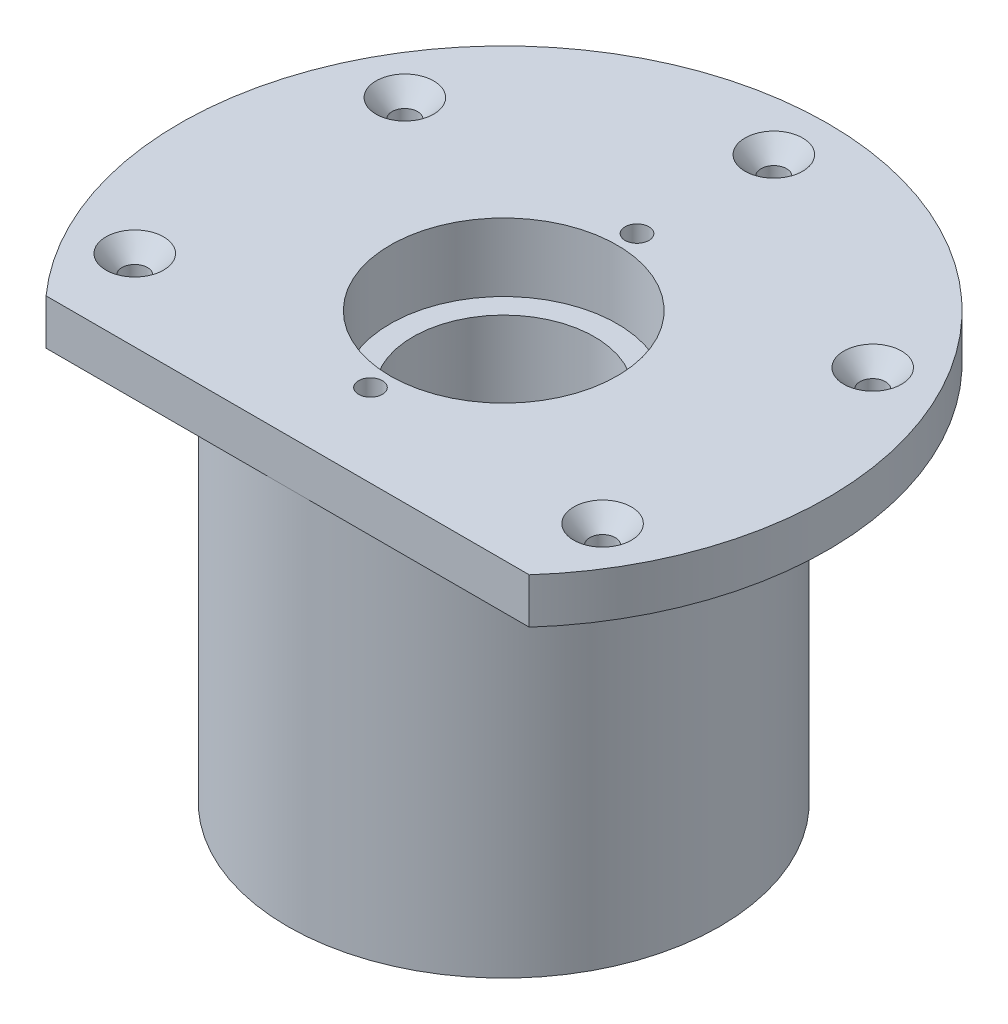
ISO-10303-21;
HEADER;
FILE_DESCRIPTION(('STEP AP214'),'2;1');
FILE_NAME('part.step','',(''),(''),'','','');
FILE_SCHEMA(('AUTOMOTIVE_DESIGN { 1 0 10303 214 1 1 1 1 }'));
ENDSEC;
DATA;
#1=APPLICATION_CONTEXT('core data for automotive mechanical design processes');
#2=APPLICATION_PROTOCOL_DEFINITION('international standard','automotive_design',2000,#1);
#3=PRODUCT_CONTEXT('',#1,'mechanical');
#4=PRODUCT('Part','Part','',(#3));
#5=PRODUCT_RELATED_PRODUCT_CATEGORY('part','',(#4));
#6=PRODUCT_DEFINITION_FORMATION('','',#4);
#7=PRODUCT_DEFINITION_CONTEXT('part definition',#1,'design');
#8=PRODUCT_DEFINITION('design','',#6,#7);
#9=PRODUCT_DEFINITION_SHAPE('','',#8);
#10=(LENGTH_UNIT() NAMED_UNIT(*) SI_UNIT(.MILLI.,.METRE.));
#11=(NAMED_UNIT(*) PLANE_ANGLE_UNIT() SI_UNIT($,.RADIAN.));
#12=(NAMED_UNIT(*) SI_UNIT($,.STERADIAN.) SOLID_ANGLE_UNIT());
#13=UNCERTAINTY_MEASURE_WITH_UNIT(LENGTH_MEASURE(1.E-05),#10,'distance_accuracy_value','');
#14=(GEOMETRIC_REPRESENTATION_CONTEXT(3) GLOBAL_UNCERTAINTY_ASSIGNED_CONTEXT((#13)) GLOBAL_UNIT_ASSIGNED_CONTEXT((#10,
#11,#12)) REPRESENTATION_CONTEXT('',''));
#15=CARTESIAN_POINT('',(0.,0.,0.));
#16=DIRECTION('',(0.,0.,1.));
#17=DIRECTION('',(1.,0.,0.));
#18=AXIS2_PLACEMENT_3D('',#15,#16,#17);
#19=CARTESIAN_POINT('',(0.,75.,0.));
#20=DIRECTION('',(0.,-1.,0.));
#21=DIRECTION('',(0.,0.,-1.));
#22=AXIS2_PLACEMENT_3D('',#19,#20,#21);
#23=CYLINDRICAL_SURFACE('',#22,20.);
#24=CARTESIAN_POINT('',(0.,0.,0.));
#25=DIRECTION('',(0.,1.,0.));
#26=DIRECTION('',(0.,0.,1.));
#27=AXIS2_PLACEMENT_3D('',#24,#25,#26);
#28=CIRCLE('',#27,20.);
#29=CARTESIAN_POINT('',(0.,0.,20.));
#30=VERTEX_POINT('',#29);
#31=EDGE_CURVE('E76',#30,#30,#28,.T.);
#32=ORIENTED_EDGE('',*,*,#31,.F.);
#33=EDGE_LOOP('',(#32));
#34=FACE_BOUND('',#33,.T.);
#35=CARTESIAN_POINT('',(0.,12.,0.));
#36=DIRECTION('',(0.,1.,0.));
#37=DIRECTION('',(0.,0.,1.));
#38=AXIS2_PLACEMENT_3D('',#35,#36,#37);
#39=CIRCLE('',#38,20.);
#40=CARTESIAN_POINT('',(0.,12.,20.));
#41=VERTEX_POINT('',#40);
#42=EDGE_CURVE('E282',#41,#41,#39,.F.);
#43=ORIENTED_EDGE('',*,*,#42,.F.);
#44=EDGE_LOOP('',(#43));
#45=FACE_BOUND('',#44,.T.);
#46=ADVANCED_FACE('F39',(#34,#45),#23,.F.);
#47=CARTESIAN_POINT('',(0.,75.,0.));
#48=DIRECTION('',(0.,-1.,0.));
#49=DIRECTION('',(0.,0.,-1.));
#50=AXIS2_PLACEMENT_3D('',#47,#48,#49);
#51=CYLINDRICAL_SURFACE('',#50,38.1);
#52=CARTESIAN_POINT('',(0.,0.,0.));
#53=DIRECTION('',(0.,1.,0.));
#54=DIRECTION('',(0.,0.,1.));
#55=AXIS2_PLACEMENT_3D('',#52,#53,#54);
#56=CIRCLE('',#55,38.1);
#57=CARTESIAN_POINT('',(0.,0.,38.1));
#58=VERTEX_POINT('',#57);
#59=EDGE_CURVE('E95',#58,#58,#56,.T.);
#60=ORIENTED_EDGE('',*,*,#59,.T.);
#61=EDGE_LOOP('',(#60));
#62=FACE_BOUND('',#61,.T.);
#63=CARTESIAN_POINT('',(0.,67.,0.));
#64=DIRECTION('',(0.,1.,0.));
#65=DIRECTION('',(0.,0.,1.));
#66=AXIS2_PLACEMENT_3D('',#63,#64,#65);
#67=CIRCLE('',#66,38.1);
#68=CARTESIAN_POINT('',(0.,67.,38.1));
#69=VERTEX_POINT('',#68);
#70=EDGE_CURVE('E47',#69,#69,#67,.T.);
#71=ORIENTED_EDGE('',*,*,#70,.F.);
#72=EDGE_LOOP('',(#71));
#73=FACE_BOUND('',#72,.T.);
#74=ADVANCED_FACE('F41',(#62,#73),#51,.T.);
#75=CARTESIAN_POINT('',(0.,75.,0.));
#76=DIRECTION('',(0.,1.,0.));
#77=DIRECTION('',(0.,0.,1.));
#78=AXIS2_PLACEMENT_3D('',#75,#76,#77);
#79=PLANE('',#78);
#80=CARTESIAN_POINT('',(0.,75.,-23.5));
#81=DIRECTION('',(0.,1.,0.));
#82=DIRECTION('',(0.,0.,1.));
#83=AXIS2_PLACEMENT_3D('',#80,#81,#82);
#84=CIRCLE('',#83,2.1);
#85=CARTESIAN_POINT('',(0.,75.,-21.4));
#86=VERTEX_POINT('',#85);
#87=EDGE_CURVE('E193',#86,#86,#84,.T.);
#88=ORIENTED_EDGE('',*,*,#87,.F.);
#89=EDGE_LOOP('',(#88));
#90=FACE_BOUND('',#89,.T.);
#91=CARTESIAN_POINT('',(0.,75.,23.5));
#92=DIRECTION('',(0.,1.,0.));
#93=DIRECTION('',(0.,0.,1.));
#94=AXIS2_PLACEMENT_3D('',#91,#92,#93);
#95=CIRCLE('',#94,2.1);
#96=CARTESIAN_POINT('',(0.,75.,25.6));
#97=VERTEX_POINT('',#96);
#98=EDGE_CURVE('E197',#97,#97,#95,.T.);
#99=ORIENTED_EDGE('',*,*,#98,.F.);
#100=EDGE_LOOP('',(#99));
#101=FACE_BOUND('',#100,.T.);
#102=CARTESIAN_POINT('',(-41.2444598552339,75.,23.8125000000001));
#103=DIRECTION('',(0.,1.,0.));
#104=DIRECTION('',(0.,0.,1.));
#105=AXIS2_PLACEMENT_3D('',#102,#103,#104);
#106=CIRCLE('',#105,5.0856896);
#107=CARTESIAN_POINT('',(-41.2444598552339,75.,28.8981896000001));
#108=VERTEX_POINT('',#107);
#109=EDGE_CURVE('E129',#108,#108,#106,.T.);
#110=ORIENTED_EDGE('',*,*,#109,.F.);
#111=EDGE_LOOP('',(#110));
#112=FACE_BOUND('',#111,.T.);
#113=CARTESIAN_POINT('',(-41.2444598552339,75.,-23.8124999999999));
#114=DIRECTION('',(0.,1.,0.));
#115=DIRECTION('',(0.,0.,1.));
#116=AXIS2_PLACEMENT_3D('',#113,#114,#115);
#117=CIRCLE('',#116,5.0856896);
#118=CARTESIAN_POINT('',(-41.2444598552339,75.,-18.7268103999999));
#119=VERTEX_POINT('',#118);
#120=EDGE_CURVE('E122',#119,#119,#117,.T.);
#121=ORIENTED_EDGE('',*,*,#120,.F.);
#122=EDGE_LOOP('',(#121));
#123=FACE_BOUND('',#122,.T.);
#124=CARTESIAN_POINT('',(0.,75.,-47.625));
#125=DIRECTION('',(0.,1.,0.));
#126=DIRECTION('',(0.,0.,1.));
#127=AXIS2_PLACEMENT_3D('',#124,#125,#126);
#128=CIRCLE('',#127,5.0856896);
#129=CARTESIAN_POINT('',(0.,75.,-42.5393104));
#130=VERTEX_POINT('',#129);
#131=EDGE_CURVE('E118',#130,#130,#128,.T.);
#132=ORIENTED_EDGE('',*,*,#131,.F.);
#133=EDGE_LOOP('',(#132));
#134=FACE_BOUND('',#133,.T.);
#135=CARTESIAN_POINT('',(41.2444598552339,75.,-23.8125000000001));
#136=DIRECTION('',(0.,1.,0.));
#137=DIRECTION('',(0.,0.,1.));
#138=AXIS2_PLACEMENT_3D('',#135,#136,#137);
#139=CIRCLE('',#138,5.0856896);
#140=CARTESIAN_POINT('',(41.2444598552339,75.,-18.7268104000001));
#141=VERTEX_POINT('',#140);
#142=EDGE_CURVE('E114',#141,#141,#139,.T.);
#143=ORIENTED_EDGE('',*,*,#142,.F.);
#144=EDGE_LOOP('',(#143));
#145=FACE_BOUND('',#144,.T.);
#146=CARTESIAN_POINT('',(41.2444598552339,75.,23.8124999999999));
#147=DIRECTION('',(0.,1.,0.));
#148=DIRECTION('',(0.,0.,1.));
#149=AXIS2_PLACEMENT_3D('',#146,#147,#148);
#150=CIRCLE('',#149,5.0856896);
#151=CARTESIAN_POINT('',(41.2444598552339,75.,28.8981895999999));
#152=VERTEX_POINT('',#151);
#153=EDGE_CURVE('E109',#152,#152,#150,.T.);
#154=ORIENTED_EDGE('',*,*,#153,.F.);
#155=EDGE_LOOP('',(#154));
#156=FACE_BOUND('',#155,.T.);
#157=DIRECTION('',(1.,0.,0.));
#158=VECTOR('',#157,1.);
#159=CARTESIAN_POINT('',(0.,75.,38.1));
#160=LINE('',#159,#158);
#161=CARTESIAN_POINT('',(-42.597094971371,75.,38.1));
#162=VERTEX_POINT('',#161);
#163=CARTESIAN_POINT('',(42.597094971371,75.,38.1));
#164=VERTEX_POINT('',#163);
#165=EDGE_CURVE('E80',#162,#164,#160,.T.);
#166=ORIENTED_EDGE('',*,*,#165,.T.);
#167=CARTESIAN_POINT('',(0.,75.,0.));
#168=DIRECTION('',(0.,1.,0.));
#169=DIRECTION('',(0.,0.,1.));
#170=AXIS2_PLACEMENT_3D('',#167,#168,#169);
#171=CIRCLE('',#170,57.15);
#172=EDGE_CURVE('E73',#164,#162,#171,.T.);
#173=ORIENTED_EDGE('',*,*,#172,.T.);
#174=EDGE_LOOP('',(#166,#173));
#175=FACE_BOUND('',#174,.T.);
#176=CARTESIAN_POINT('',(0.,75.,0.));
#177=DIRECTION('',(0.,1.,0.));
#178=DIRECTION('',(0.,0.,1.));
#179=AXIS2_PLACEMENT_3D('',#176,#177,#178);
#180=CIRCLE('',#179,20.);
#181=CARTESIAN_POINT('',(0.,75.,20.));
#182=VERTEX_POINT('',#181);
#183=EDGE_CURVE('E96',#182,#182,#180,.T.);
#184=ORIENTED_EDGE('',*,*,#183,.F.);
#185=EDGE_LOOP('',(#184));
#186=FACE_BOUND('',#185,.T.);
#187=ADVANCED_FACE('F85',(#90,#101,#112,#123,#134,#145,#156,#175,#186),#79,.T.);
#188=CARTESIAN_POINT('',(0.,0.,0.));
#189=DIRECTION('',(0.,1.,0.));
#190=DIRECTION('',(0.,0.,1.));
#191=AXIS2_PLACEMENT_3D('',#188,#189,#190);
#192=PLANE('',#191);
#193=CARTESIAN_POINT('',(0.,0.,-23.5));
#194=DIRECTION('',(0.,1.,0.));
#195=DIRECTION('',(0.,0.,1.));
#196=AXIS2_PLACEMENT_3D('',#193,#194,#195);
#197=CIRCLE('',#196,2.09999999999999);
#198=CARTESIAN_POINT('',(0.,0.,-21.4));
#199=VERTEX_POINT('',#198);
#200=EDGE_CURVE('E273',#199,#199,#197,.T.);
#201=ORIENTED_EDGE('',*,*,#200,.T.);
#202=EDGE_LOOP('',(#201));
#203=FACE_BOUND('',#202,.T.);
#204=CARTESIAN_POINT('',(0.,0.,23.5));
#205=DIRECTION('',(0.,1.,0.));
#206=DIRECTION('',(0.,0.,1.));
#207=AXIS2_PLACEMENT_3D('',#204,#205,#206);
#208=CIRCLE('',#207,2.09999999999999);
#209=CARTESIAN_POINT('',(0.,0.,25.6));
#210=VERTEX_POINT('',#209);
#211=EDGE_CURVE('E278',#210,#210,#208,.T.);
#212=ORIENTED_EDGE('',*,*,#211,.T.);
#213=EDGE_LOOP('',(#212));
#214=FACE_BOUND('',#213,.T.);
#215=ORIENTED_EDGE('',*,*,#59,.F.);
#216=EDGE_LOOP('',(#215));
#217=FACE_BOUND('',#216,.T.);
#218=ORIENTED_EDGE('',*,*,#31,.T.);
#219=EDGE_LOOP('',(#218));
#220=FACE_BOUND('',#219,.T.);
#221=ADVANCED_FACE('F177',(#203,#214,#217,#220),#192,.F.);
#222=CARTESIAN_POINT('',(0.,63.,0.));
#223=DIRECTION('',(0.,1.,0.));
#224=DIRECTION('',(0.,0.,1.));
#225=AXIS2_PLACEMENT_3D('',#222,#223,#224);
#226=CIRCLE('',#225,20.);
#227=CARTESIAN_POINT('',(0.,63.,20.));
#228=VERTEX_POINT('',#227);
#229=EDGE_CURVE('E12',#228,#228,#226,.T.);
#230=ORIENTED_EDGE('',*,*,#229,.F.);
#231=EDGE_LOOP('',(#230));
#232=FACE_BOUND('',#231,.T.);
#233=ORIENTED_EDGE('',*,*,#183,.T.);
#234=EDGE_LOOP('',(#233));
#235=FACE_BOUND('',#234,.T.);
#236=ADVANCED_FACE('F162',(#232,#235),#23,.F.);
#237=CARTESIAN_POINT('',(0.,67.,38.1));
#238=DIRECTION('',(0.,0.,1.));
#239=DIRECTION('',(1.,0.,0.));
#240=AXIS2_PLACEMENT_3D('',#237,#238,#239);
#241=PLANE('',#240);
#242=DIRECTION('',(1.,0.,0.));
#243=VECTOR('',#242,1.);
#244=CARTESIAN_POINT('',(0.,67.,38.1));
#245=LINE('',#244,#243);
#246=CARTESIAN_POINT('',(-42.597094971371,67.,38.1));
#247=VERTEX_POINT('',#246);
#248=EDGE_CURVE('E89',#247,#69,#245,.T.);
#249=ORIENTED_EDGE('',*,*,#248,.T.);
#250=CARTESIAN_POINT('',(42.597094971371,67.,38.1));
#251=VERTEX_POINT('',#250);
#252=EDGE_CURVE('E87',#69,#251,#245,.T.);
#253=ORIENTED_EDGE('',*,*,#252,.T.);
#254=DIRECTION('',(0.,1.,0.));
#255=VECTOR('',#254,1.);
#256=CARTESIAN_POINT('',(42.597094971371,67.,38.1));
#257=LINE('',#256,#255);
#258=EDGE_CURVE('E77',#251,#164,#257,.T.);
#259=ORIENTED_EDGE('',*,*,#258,.T.);
#260=ORIENTED_EDGE('',*,*,#165,.F.);
#261=DIRECTION('',(0.,1.,0.));
#262=VECTOR('',#261,1.);
#263=CARTESIAN_POINT('',(-42.597094971371,67.,38.1));
#264=LINE('',#263,#262);
#265=EDGE_CURVE('E59',#247,#162,#264,.T.);
#266=ORIENTED_EDGE('',*,*,#265,.F.);
#267=EDGE_LOOP('',(#249,#253,#259,#260,#266));
#268=FACE_BOUND('',#267,.T.);
#269=ADVANCED_FACE('F81',(#268),#241,.T.);
#270=CARTESIAN_POINT('',(0.,67.,0.));
#271=DIRECTION('',(0.,1.,0.));
#272=DIRECTION('',(0.,0.,1.));
#273=AXIS2_PLACEMENT_3D('',#270,#271,#272);
#274=PLANE('',#273);
#275=CARTESIAN_POINT('',(-41.2444598552339,67.,23.8125000000001));
#276=DIRECTION('',(0.,1.,0.));
#277=DIRECTION('',(0.,0.,1.));
#278=AXIS2_PLACEMENT_3D('',#275,#276,#277);
#279=CIRCLE('',#278,2.24789999999998);
#280=CARTESIAN_POINT('',(-41.2444598552339,67.,26.0604));
#281=VERTEX_POINT('',#280);
#282=EDGE_CURVE('E120',#281,#281,#279,.T.);
#283=ORIENTED_EDGE('',*,*,#282,.T.);
#284=EDGE_LOOP('',(#283));
#285=FACE_BOUND('',#284,.T.);
#286=CARTESIAN_POINT('',(-41.2444598552339,67.,-23.8124999999999));
#287=DIRECTION('',(0.,1.,0.));
#288=DIRECTION('',(0.,0.,1.));
#289=AXIS2_PLACEMENT_3D('',#286,#287,#288);
#290=CIRCLE('',#289,2.24789999999998);
#291=CARTESIAN_POINT('',(-41.2444598552339,67.,-21.5645999999999));
#292=VERTEX_POINT('',#291);
#293=EDGE_CURVE('E116',#292,#292,#290,.T.);
#294=ORIENTED_EDGE('',*,*,#293,.T.);
#295=EDGE_LOOP('',(#294));
#296=FACE_BOUND('',#295,.T.);
#297=CARTESIAN_POINT('',(0.,67.,-47.625));
#298=DIRECTION('',(0.,1.,0.));
#299=DIRECTION('',(0.,0.,1.));
#300=AXIS2_PLACEMENT_3D('',#297,#298,#299);
#301=CIRCLE('',#300,2.24789999999999);
#302=CARTESIAN_POINT('',(0.,67.,-45.3771));
#303=VERTEX_POINT('',#302);
#304=EDGE_CURVE('E111',#303,#303,#301,.T.);
#305=ORIENTED_EDGE('',*,*,#304,.T.);
#306=EDGE_LOOP('',(#305));
#307=FACE_BOUND('',#306,.T.);
#308=CARTESIAN_POINT('',(41.2444598552339,67.,-23.8125000000001));
#309=DIRECTION('',(0.,1.,0.));
#310=DIRECTION('',(0.,0.,1.));
#311=AXIS2_PLACEMENT_3D('',#308,#309,#310);
#312=CIRCLE('',#311,2.24789999999998);
#313=CARTESIAN_POINT('',(41.2444598552339,67.,-21.5646000000001));
#314=VERTEX_POINT('',#313);
#315=EDGE_CURVE('E106',#314,#314,#312,.T.);
#316=ORIENTED_EDGE('',*,*,#315,.T.);
#317=EDGE_LOOP('',(#316));
#318=FACE_BOUND('',#317,.T.);
#319=CARTESIAN_POINT('',(41.2444598552339,67.,23.8124999999999));
#320=DIRECTION('',(0.,1.,0.));
#321=DIRECTION('',(0.,0.,1.));
#322=AXIS2_PLACEMENT_3D('',#319,#320,#321);
#323=CIRCLE('',#322,2.24789999999998);
#324=CARTESIAN_POINT('',(41.2444598552339,67.,26.0603999999999));
#325=VERTEX_POINT('',#324);
#326=EDGE_CURVE('E83',#325,#325,#323,.T.);
#327=ORIENTED_EDGE('',*,*,#326,.T.);
#328=EDGE_LOOP('',(#327));
#329=FACE_BOUND('',#328,.T.);
#330=ORIENTED_EDGE('',*,*,#252,.F.);
#331=ORIENTED_EDGE('',*,*,#70,.T.);
#332=ORIENTED_EDGE('',*,*,#248,.F.);
#333=CARTESIAN_POINT('',(0.,67.,0.));
#334=DIRECTION('',(0.,1.,0.));
#335=DIRECTION('',(0.,0.,1.));
#336=AXIS2_PLACEMENT_3D('',#333,#334,#335);
#337=CIRCLE('',#336,57.15);
#338=EDGE_CURVE('E75',#251,#247,#337,.T.);
#339=ORIENTED_EDGE('',*,*,#338,.F.);
#340=EDGE_LOOP('',(#330,#331,#332,#339));
#341=FACE_BOUND('',#340,.T.);
#342=ADVANCED_FACE('F153',(#285,#296,#307,#318,#329,#341),#274,.F.);
#343=CARTESIAN_POINT('',(0.,67.,0.));
#344=DIRECTION('',(0.,1.,0.));
#345=DIRECTION('',(0.,0.,1.));
#346=AXIS2_PLACEMENT_3D('',#343,#344,#345);
#347=CYLINDRICAL_SURFACE('',#346,57.15);
#348=ORIENTED_EDGE('',*,*,#172,.F.);
#349=ORIENTED_EDGE('',*,*,#258,.F.);
#350=ORIENTED_EDGE('',*,*,#338,.T.);
#351=ORIENTED_EDGE('',*,*,#265,.T.);
#352=EDGE_LOOP('',(#348,#349,#350,#351));
#353=FACE_BOUND('',#352,.T.);
#354=ADVANCED_FACE('F70',(#353),#347,.T.);
#355=CARTESIAN_POINT('',(41.2444598552339,75.,23.8124999999999));
#356=DIRECTION('',(0.,1.,0.));
#357=DIRECTION('',(0.,0.,1.));
#358=AXIS2_PLACEMENT_3D('',#355,#356,#357);
#359=CYLINDRICAL_SURFACE('',#358,2.24789999999998);
#360=CARTESIAN_POINT('',(41.2444598552339,71.7354964978196,23.8124999999999));
#361=DIRECTION('',(0.,1.,0.));
#362=DIRECTION('',(0.,0.,1.));
#363=AXIS2_PLACEMENT_3D('',#360,#361,#362);
#364=CIRCLE('',#363,2.24789999999998);
#365=CARTESIAN_POINT('',(41.2444598552339,71.7354964978196,26.0603999999999));
#366=VERTEX_POINT('',#365);
#367=EDGE_CURVE('E105',#366,#366,#364,.T.);
#368=ORIENTED_EDGE('',*,*,#367,.T.);
#369=EDGE_LOOP('',(#368));
#370=FACE_BOUND('',#369,.T.);
#371=ORIENTED_EDGE('',*,*,#326,.F.);
#372=EDGE_LOOP('',(#371));
#373=FACE_BOUND('',#372,.T.);
#374=ADVANCED_FACE('F160',(#370,#373),#359,.F.);
#375=CARTESIAN_POINT('',(41.2444598552339,75.,23.8124999999999));
#376=DIRECTION('',(0.,1.,0.));
#377=DIRECTION('',(0.,0.,1.));
#378=AXIS2_PLACEMENT_3D('',#375,#376,#377);
#379=CONICAL_SURFACE('',#378,5.0856896,0.715584993317676);
#380=ORIENTED_EDGE('',*,*,#367,.F.);
#381=EDGE_LOOP('',(#380));
#382=FACE_BOUND('',#381,.T.);
#383=ORIENTED_EDGE('',*,*,#153,.T.);
#384=EDGE_LOOP('',(#383));
#385=FACE_BOUND('',#384,.T.);
#386=ADVANCED_FACE('F208',(#382,#385),#379,.F.);
#387=CARTESIAN_POINT('',(41.2444598552339,75.,-23.8125000000001));
#388=DIRECTION('',(0.,1.,0.));
#389=DIRECTION('',(0.,0.,1.));
#390=AXIS2_PLACEMENT_3D('',#387,#388,#389);
#391=CYLINDRICAL_SURFACE('',#390,2.24789999999998);
#392=CARTESIAN_POINT('',(41.2444598552339,71.7354964978196,-23.8125000000001));
#393=DIRECTION('',(0.,1.,0.));
#394=DIRECTION('',(0.,0.,1.));
#395=AXIS2_PLACEMENT_3D('',#392,#393,#394);
#396=CIRCLE('',#395,2.24789999999998);
#397=CARTESIAN_POINT('',(41.2444598552339,71.7354964978196,-21.5646000000001));
#398=VERTEX_POINT('',#397);
#399=EDGE_CURVE('E110',#398,#398,#396,.T.);
#400=ORIENTED_EDGE('',*,*,#399,.T.);
#401=EDGE_LOOP('',(#400));
#402=FACE_BOUND('',#401,.T.);
#403=ORIENTED_EDGE('',*,*,#315,.F.);
#404=EDGE_LOOP('',(#403));
#405=FACE_BOUND('',#404,.T.);
#406=ADVANCED_FACE('F210',(#402,#405),#391,.F.);
#407=CARTESIAN_POINT('',(41.2444598552339,75.,-23.8125000000001));
#408=DIRECTION('',(0.,1.,0.));
#409=DIRECTION('',(0.,0.,1.));
#410=AXIS2_PLACEMENT_3D('',#407,#408,#409);
#411=CONICAL_SURFACE('',#410,5.0856896,0.715584993317676);
#412=ORIENTED_EDGE('',*,*,#399,.F.);
#413=EDGE_LOOP('',(#412));
#414=FACE_BOUND('',#413,.T.);
#415=ORIENTED_EDGE('',*,*,#142,.T.);
#416=EDGE_LOOP('',(#415));
#417=FACE_BOUND('',#416,.T.);
#418=ADVANCED_FACE('F217',(#414,#417),#411,.F.);
#419=CARTESIAN_POINT('',(0.,75.,-47.625));
#420=DIRECTION('',(0.,1.,0.));
#421=DIRECTION('',(0.,0.,1.));
#422=AXIS2_PLACEMENT_3D('',#419,#420,#421);
#423=CYLINDRICAL_SURFACE('',#422,2.24789999999999);
#424=CARTESIAN_POINT('',(0.,71.7354964978196,-47.625));
#425=DIRECTION('',(0.,1.,0.));
#426=DIRECTION('',(0.,0.,1.));
#427=AXIS2_PLACEMENT_3D('',#424,#425,#426);
#428=CIRCLE('',#427,2.24789999999999);
#429=CARTESIAN_POINT('',(0.,71.7354964978196,-45.3771));
#430=VERTEX_POINT('',#429);
#431=EDGE_CURVE('E115',#430,#430,#428,.T.);
#432=ORIENTED_EDGE('',*,*,#431,.T.);
#433=EDGE_LOOP('',(#432));
#434=FACE_BOUND('',#433,.T.);
#435=ORIENTED_EDGE('',*,*,#304,.F.);
#436=EDGE_LOOP('',(#435));
#437=FACE_BOUND('',#436,.T.);
#438=ADVANCED_FACE('F225',(#434,#437),#423,.F.);
#439=CARTESIAN_POINT('',(0.,75.,-47.625));
#440=DIRECTION('',(0.,1.,0.));
#441=DIRECTION('',(0.,0.,1.));
#442=AXIS2_PLACEMENT_3D('',#439,#440,#441);
#443=CONICAL_SURFACE('',#442,5.0856896,0.715584993317676);
#444=ORIENTED_EDGE('',*,*,#431,.F.);
#445=EDGE_LOOP('',(#444));
#446=FACE_BOUND('',#445,.T.);
#447=ORIENTED_EDGE('',*,*,#131,.T.);
#448=EDGE_LOOP('',(#447));
#449=FACE_BOUND('',#448,.T.);
#450=ADVANCED_FACE('F229',(#446,#449),#443,.F.);
#451=CARTESIAN_POINT('',(-41.2444598552339,75.,-23.8124999999999));
#452=DIRECTION('',(0.,1.,0.));
#453=DIRECTION('',(0.,0.,1.));
#454=AXIS2_PLACEMENT_3D('',#451,#452,#453);
#455=CYLINDRICAL_SURFACE('',#454,2.24789999999998);
#456=CARTESIAN_POINT('',(-41.2444598552339,71.7354964978196,-23.8124999999999));
#457=DIRECTION('',(0.,1.,0.));
#458=DIRECTION('',(0.,0.,1.));
#459=AXIS2_PLACEMENT_3D('',#456,#457,#458);
#460=CIRCLE('',#459,2.24789999999998);
#461=CARTESIAN_POINT('',(-41.2444598552339,71.7354964978196,-21.5645999999999));
#462=VERTEX_POINT('',#461);
#463=EDGE_CURVE('E119',#462,#462,#460,.T.);
#464=ORIENTED_EDGE('',*,*,#463,.T.);
#465=EDGE_LOOP('',(#464));
#466=FACE_BOUND('',#465,.T.);
#467=ORIENTED_EDGE('',*,*,#293,.F.);
#468=EDGE_LOOP('',(#467));
#469=FACE_BOUND('',#468,.T.);
#470=ADVANCED_FACE('F233',(#466,#469),#455,.F.);
#471=CARTESIAN_POINT('',(-41.2444598552339,75.,-23.8124999999999));
#472=DIRECTION('',(0.,1.,0.));
#473=DIRECTION('',(0.,0.,1.));
#474=AXIS2_PLACEMENT_3D('',#471,#472,#473);
#475=CONICAL_SURFACE('',#474,5.0856896,0.715584993317676);
#476=ORIENTED_EDGE('',*,*,#463,.F.);
#477=EDGE_LOOP('',(#476));
#478=FACE_BOUND('',#477,.T.);
#479=ORIENTED_EDGE('',*,*,#120,.T.);
#480=EDGE_LOOP('',(#479));
#481=FACE_BOUND('',#480,.T.);
#482=ADVANCED_FACE('F237',(#478,#481),#475,.F.);
#483=CARTESIAN_POINT('',(-41.2444598552339,75.,23.8125000000001));
#484=DIRECTION('',(0.,1.,0.));
#485=DIRECTION('',(0.,0.,1.));
#486=AXIS2_PLACEMENT_3D('',#483,#484,#485);
#487=CYLINDRICAL_SURFACE('',#486,2.24789999999998);
#488=CARTESIAN_POINT('',(-41.2444598552339,71.7354964978196,23.8125000000001));
#489=DIRECTION('',(0.,1.,0.));
#490=DIRECTION('',(0.,0.,1.));
#491=AXIS2_PLACEMENT_3D('',#488,#489,#490);
#492=CIRCLE('',#491,2.24789999999998);
#493=CARTESIAN_POINT('',(-41.2444598552339,71.7354964978196,26.0604));
#494=VERTEX_POINT('',#493);
#495=EDGE_CURVE('E123',#494,#494,#492,.T.);
#496=ORIENTED_EDGE('',*,*,#495,.T.);
#497=EDGE_LOOP('',(#496));
#498=FACE_BOUND('',#497,.T.);
#499=ORIENTED_EDGE('',*,*,#282,.F.);
#500=EDGE_LOOP('',(#499));
#501=FACE_BOUND('',#500,.T.);
#502=ADVANCED_FACE('F241',(#498,#501),#487,.F.);
#503=CARTESIAN_POINT('',(-41.2444598552339,75.,23.8125000000001));
#504=DIRECTION('',(0.,1.,0.));
#505=DIRECTION('',(0.,0.,1.));
#506=AXIS2_PLACEMENT_3D('',#503,#504,#505);
#507=CONICAL_SURFACE('',#506,5.0856896,0.715584993317676);
#508=ORIENTED_EDGE('',*,*,#495,.F.);
#509=EDGE_LOOP('',(#508));
#510=FACE_BOUND('',#509,.T.);
#511=ORIENTED_EDGE('',*,*,#109,.T.);
#512=EDGE_LOOP('',(#511));
#513=FACE_BOUND('',#512,.T.);
#514=ADVANCED_FACE('F245',(#510,#513),#507,.F.);
#515=CARTESIAN_POINT('',(0.,63.,0.));
#516=DIRECTION('',(0.,1.,0.));
#517=DIRECTION('',(0.,0.,1.));
#518=AXIS2_PLACEMENT_3D('',#515,#516,#517);
#519=PLANE('',#518);
#520=CARTESIAN_POINT('',(0.,63.,0.));
#521=DIRECTION('',(0.,1.,0.));
#522=DIRECTION('',(0.,0.,1.));
#523=AXIS2_PLACEMENT_3D('',#520,#521,#522);
#524=CIRCLE('',#523,16.);
#525=CARTESIAN_POINT('',(0.,63.,16.));
#526=VERTEX_POINT('',#525);
#527=EDGE_CURVE('E281',#526,#526,#524,.T.);
#528=ORIENTED_EDGE('',*,*,#527,.F.);
#529=EDGE_LOOP('',(#528));
#530=FACE_BOUND('',#529,.T.);
#531=ORIENTED_EDGE('',*,*,#229,.T.);
#532=EDGE_LOOP('',(#531));
#533=FACE_BOUND('',#532,.T.);
#534=ADVANCED_FACE('F248',(#530,#533),#519,.T.);
#535=CARTESIAN_POINT('',(0.,-56.5685424949238,0.));
#536=DIRECTION('',(0.,1.,0.));
#537=DIRECTION('',(0.,0.,1.));
#538=AXIS2_PLACEMENT_3D('',#535,#536,#537);
#539=CYLINDRICAL_SURFACE('',#538,16.);
#540=CARTESIAN_POINT('',(0.,12.,0.));
#541=DIRECTION('',(0.,1.,0.));
#542=DIRECTION('',(0.,0.,1.));
#543=AXIS2_PLACEMENT_3D('',#540,#541,#542);
#544=CIRCLE('',#543,16.);
#545=CARTESIAN_POINT('',(0.,12.,16.));
#546=VERTEX_POINT('',#545);
#547=EDGE_CURVE('E134',#546,#546,#544,.F.);
#548=ORIENTED_EDGE('',*,*,#547,.T.);
#549=EDGE_LOOP('',(#548));
#550=FACE_BOUND('',#549,.T.);
#551=ORIENTED_EDGE('',*,*,#527,.T.);
#552=EDGE_LOOP('',(#551));
#553=FACE_BOUND('',#552,.T.);
#554=ADVANCED_FACE('F252',(#550,#553),#539,.F.);
#555=CARTESIAN_POINT('',(0.,12.,0.));
#556=DIRECTION('',(0.,1.,0.));
#557=DIRECTION('',(0.,0.,1.));
#558=AXIS2_PLACEMENT_3D('',#555,#556,#557);
#559=PLANE('',#558);
#560=ORIENTED_EDGE('',*,*,#42,.T.);
#561=EDGE_LOOP('',(#560));
#562=FACE_BOUND('',#561,.T.);
#563=ORIENTED_EDGE('',*,*,#547,.F.);
#564=EDGE_LOOP('',(#563));
#565=FACE_BOUND('',#564,.T.);
#566=ADVANCED_FACE('F256',(#562,#565),#559,.F.);
#567=CARTESIAN_POINT('',(0.,75.,23.5));
#568=DIRECTION('',(0.,1.,0.));
#569=DIRECTION('',(0.,0.,1.));
#570=AXIS2_PLACEMENT_3D('',#567,#568,#569);
#571=CYLINDRICAL_SURFACE('',#570,2.09999999999999);
#572=ORIENTED_EDGE('',*,*,#211,.F.);
#573=EDGE_LOOP('',(#572));
#574=FACE_BOUND('',#573,.T.);
#575=ORIENTED_EDGE('',*,*,#98,.T.);
#576=EDGE_LOOP('',(#575));
#577=FACE_BOUND('',#576,.T.);
#578=ADVANCED_FACE('F260',(#574,#577),#571,.F.);
#579=CARTESIAN_POINT('',(0.,75.,-23.5));
#580=DIRECTION('',(0.,1.,0.));
#581=DIRECTION('',(0.,0.,1.));
#582=AXIS2_PLACEMENT_3D('',#579,#580,#581);
#583=CYLINDRICAL_SURFACE('',#582,2.09999999999999);
#584=ORIENTED_EDGE('',*,*,#200,.F.);
#585=EDGE_LOOP('',(#584));
#586=FACE_BOUND('',#585,.T.);
#587=ORIENTED_EDGE('',*,*,#87,.T.);
#588=EDGE_LOOP('',(#587));
#589=FACE_BOUND('',#588,.T.);
#590=ADVANCED_FACE('F264',(#586,#589),#583,.F.);
#591=CLOSED_SHELL('',(#46,#74,#187,#221,#236,#269,#342,#354,#374,#386,#406,#418,#438,#450,#470,
#482,#502,#514,#534,#554,#566,#578,#590));
#592=MANIFOLD_SOLID_BREP('B2',#591);
#593=ADVANCED_BREP_SHAPE_REPRESENTATION('',(#18,#592),#14);
#594=SHAPE_DEFINITION_REPRESENTATION(#9,#593);
ENDSEC;
END-ISO-10303-21;
